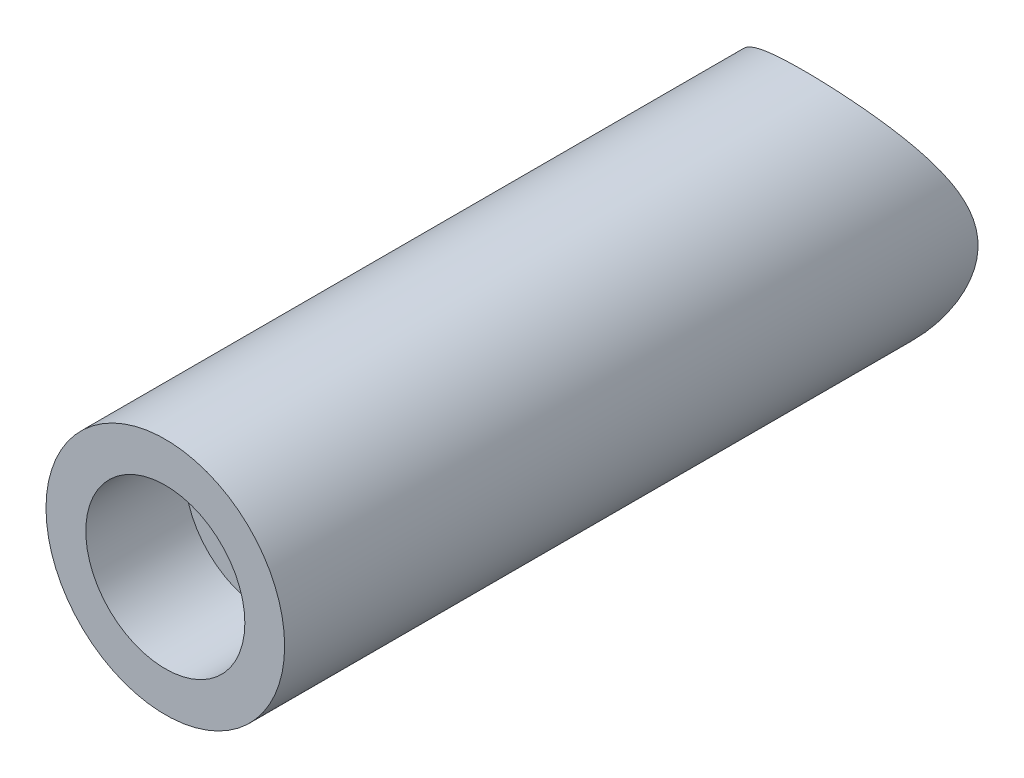
ISO-10303-21;
HEADER;
FILE_DESCRIPTION(('STEP AP214'),'2;1');
FILE_NAME('part.step','',(''),(''),'','','');
FILE_SCHEMA(('AUTOMOTIVE_DESIGN { 1 0 10303 214 1 1 1 1 }'));
ENDSEC;
DATA;
#1=APPLICATION_CONTEXT('core data for automotive mechanical design processes');
#2=APPLICATION_PROTOCOL_DEFINITION('international standard','automotive_design',2000,#1);
#3=PRODUCT_CONTEXT('',#1,'mechanical');
#4=PRODUCT('Part','Part','',(#3));
#5=PRODUCT_RELATED_PRODUCT_CATEGORY('part','',(#4));
#6=PRODUCT_DEFINITION_FORMATION('','',#4);
#7=PRODUCT_DEFINITION_CONTEXT('part definition',#1,'design');
#8=PRODUCT_DEFINITION('design','',#6,#7);
#9=PRODUCT_DEFINITION_SHAPE('','',#8);
#10=(LENGTH_UNIT() NAMED_UNIT(*) SI_UNIT(.MILLI.,.METRE.));
#11=(NAMED_UNIT(*) PLANE_ANGLE_UNIT() SI_UNIT($,.RADIAN.));
#12=(NAMED_UNIT(*) SI_UNIT($,.STERADIAN.) SOLID_ANGLE_UNIT());
#13=UNCERTAINTY_MEASURE_WITH_UNIT(LENGTH_MEASURE(1.E-05),#10,'distance_accuracy_value','');
#14=(GEOMETRIC_REPRESENTATION_CONTEXT(3) GLOBAL_UNCERTAINTY_ASSIGNED_CONTEXT((#13)) GLOBAL_UNIT_ASSIGNED_CONTEXT((#10,
#11,#12)) REPRESENTATION_CONTEXT('',''));
#15=CARTESIAN_POINT('',(0.,0.,0.));
#16=DIRECTION('',(0.,0.,1.));
#17=DIRECTION('',(1.,0.,0.));
#18=AXIS2_PLACEMENT_3D('',#15,#16,#17);
#19=CARTESIAN_POINT('',(0.,0.,762.));
#20=DIRECTION('',(0.,0.,-1.));
#21=DIRECTION('',(-1.,0.,0.));
#22=AXIS2_PLACEMENT_3D('',#19,#20,#21);
#23=CYLINDRICAL_SURFACE('',#22,114.3);
#24=CARTESIAN_POINT('',(-114.3,0.,97.7038659624071));
#25=CARTESIAN_POINT('',(-114.299998173717,-1.32571052443829,97.7038698130253));
#26=CARTESIAN_POINT('',(-114.276918905177,-2.65147226982843,97.7308874947989));
#27=CARTESIAN_POINT('',(-114.184775988168,-5.29924886023999,97.8385264291202));
#28=CARTESIAN_POINT('',(-114.115709834249,-6.62126349717085,97.9191506022472));
#29=CARTESIAN_POINT('',(-113.9321036409,-9.25811839449361,98.1327212714783));
#30=CARTESIAN_POINT('',(-113.817555207513,-10.5729572851364,98.2656774256426));
#31=CARTESIAN_POINT('',(-113.543817266426,-13.1918550803273,98.5818473309332));
#32=CARTESIAN_POINT('',(-113.384628125858,-14.4959140734404,98.7650606687355));
#33=CARTESIAN_POINT('',(-113.022145680452,-17.0941601595688,99.1796651281372));
#34=CARTESIAN_POINT('',(-112.81872340947,-18.3883066824846,99.4111970462304));
#35=CARTESIAN_POINT('',(-112.369302994794,-20.9602989364301,99.9189172369976));
#36=CARTESIAN_POINT('',(-112.123304860284,-22.238144670976,100.195105500039));
#37=CARTESIAN_POINT('',(-111.590077519137,-24.7754974381422,100.788635734019));
#38=CARTESIAN_POINT('',(-111.302848515059,-26.0350045608226,101.105977502779));
#39=CARTESIAN_POINT('',(-110.688483428269,-28.5342958023421,101.778201865702));
#40=CARTESIAN_POINT('',(-110.361340442697,-29.7740764675914,102.133090952012));
#41=CARTESIAN_POINT('',(-109.596950572759,-32.4865033467598,102.953483203549));
#42=CARTESIAN_POINT('',(-109.150919210965,-33.9543484556617,103.426692226416));
#43=CARTESIAN_POINT('',(-108.204970422224,-36.8579191384516,104.415937995963));
#44=CARTESIAN_POINT('',(-107.705048742035,-38.2936421663207,104.931978122307));
#45=CARTESIAN_POINT('',(-106.653254256036,-41.1322851875387,106.000853917905));
#46=CARTESIAN_POINT('',(-106.101371127357,-42.5351985933953,106.553696892142));
#47=CARTESIAN_POINT('',(-104.947526781943,-45.3074032081738,107.690333100009));
#48=CARTESIAN_POINT('',(-104.345566316558,-46.6766949211488,108.274125869228));
#49=CARTESIAN_POINT('',(-103.092544047155,-49.3826116058595,109.467859207817));
#50=CARTESIAN_POINT('',(-102.441440115021,-50.719207219145,110.077822013594));
#51=CARTESIAN_POINT('',(-101.091879529356,-53.3583974541999,111.318495685108));
#52=CARTESIAN_POINT('',(-100.393422748018,-54.6609919841869,111.949206606841));
#53=CARTESIAN_POINT('',(-98.9503084833774,-57.231978388269,113.22676572314));
#54=CARTESIAN_POINT('',(-98.2056561221241,-58.5003740319575,113.873612123905));
#55=CARTESIAN_POINT('',(-96.6709577319723,-61.0030375208604,115.1793229561));
#56=CARTESIAN_POINT('',(-95.8809116432499,-62.237305321095,115.838187403366));
#57=CARTESIAN_POINT('',(-94.2368093095596,-64.7005274612418,117.179825844507));
#58=CARTESIAN_POINT('',(-93.3816774819301,-65.9286570395399,117.862795775737));
#59=CARTESIAN_POINT('',(-91.6251939174194,-68.3487332204183,119.233385617021));
#60=CARTESIAN_POINT('',(-90.7238420150354,-69.5406796934116,119.921005543719));
#61=CARTESIAN_POINT('',(-88.8754230438265,-71.8879736637333,121.297247676776));
#62=CARTESIAN_POINT('',(-87.928356193339,-73.0433213358162,121.985869878333));
#63=CARTESIAN_POINT('',(-85.9888529579916,-75.316930622113,123.3607136663));
#64=CARTESIAN_POINT('',(-84.9964135198232,-76.4351897317216,124.046935087797));
#65=CARTESIAN_POINT('',(-82.9674199386797,-78.6328941910222,125.41306640924));
#66=CARTESIAN_POINT('',(-81.9309026542488,-79.7123706299603,126.092981025165));
#67=CARTESIAN_POINT('',(-79.8133393373266,-81.8325462896738,127.443883904911));
#68=CARTESIAN_POINT('',(-78.7322934423287,-82.8732456301644,128.114872196287));
#69=CARTESIAN_POINT('',(-76.5260606544396,-84.9147261770998,129.444800849204));
#70=CARTESIAN_POINT('',(-75.4008751647396,-85.9155086504593,130.10374159276));
#71=CARTESIAN_POINT('',(-73.1067302081591,-87.875892593698,131.406550446403));
#72=CARTESIAN_POINT('',(-71.9377708486942,-88.8354941646174,132.050418593469));
#73=CARTESIAN_POINT('',(-69.6066597162465,-90.6725509071403,133.293356709369));
#74=CARTESIAN_POINT('',(-68.4462904890665,-91.5517635937006,133.893171763262));
#75=CARTESIAN_POINT('',(-66.0863734558186,-93.2695618314133,135.073562291147));
#76=CARTESIAN_POINT('',(-64.8868265356276,-94.108148300133,135.654138199572));
#77=CARTESIAN_POINT('',(-62.4491172219489,-95.7431551649096,136.793469834306));
#78=CARTESIAN_POINT('',(-61.2109527493769,-96.5395732844663,137.352224382141));
#79=CARTESIAN_POINT('',(-58.6969985382342,-98.0883877541153,138.445210185389));
#80=CARTESIAN_POINT('',(-57.4212123793237,-98.8407882722347,138.979443761658));
#81=CARTESIAN_POINT('',(-54.8327518308268,-100.299884417014,140.020895333341));
#82=CARTESIAN_POINT('',(-53.5200731242619,-101.006574662678,140.528110146881));
#83=CARTESIAN_POINT('',(-50.8593364036407,-102.372133334599,141.512809867642));
#84=CARTESIAN_POINT('',(-49.5112821549196,-103.031006822535,141.99029792085));
#85=CARTESIAN_POINT('',(-46.7809613317444,-104.299077449738,142.913098935584));
#86=CARTESIAN_POINT('',(-45.3986903683221,-104.908268172718,143.358407740474));
#87=CARTESIAN_POINT('',(-42.602025707983,-106.074750030407,144.214219027267));
#88=CARTESIAN_POINT('',(-41.1876357535606,-106.632047173532,144.624725538204));
#89=CARTESIAN_POINT('',(-38.3151775342389,-107.697752163739,145.41224549907));
#90=CARTESIAN_POINT('',(-36.856823427939,-108.205650371059,145.788907260424));
#91=CARTESIAN_POINT('',(-33.9117775581418,-109.164460533069,146.501952689854));
#92=CARTESIAN_POINT('',(-32.4250857405833,-109.615372379031,146.838336281081));
#93=CARTESIAN_POINT('',(-29.4260986173269,-110.458231202929,147.468599908935));
#94=CARTESIAN_POINT('',(-27.9138022505499,-110.85017573051,147.762478179258));
#95=CARTESIAN_POINT('',(-24.8668078399622,-111.573220517443,148.30567089199));
#96=CARTESIAN_POINT('',(-23.3321098956016,-111.904321046819,148.554985532171));
#97=CARTESIAN_POINT('',(-20.2453652392331,-112.503708363047,149.007017014512));
#98=CARTESIAN_POINT('',(-18.6933381430456,-112.772059855379,149.209781853878));
#99=CARTESIAN_POINT('',(-15.574096454101,-113.244981374103,149.567534256514));
#100=CARTESIAN_POINT('',(-14.0068817017195,-113.449550729384,149.722521317068));
#101=CARTESIAN_POINT('',(-10.8615198384025,-113.793760734167,149.983508487044));
#102=CARTESIAN_POINT('',(-9.28337443339063,-113.933411293564,150.089516073198));
#103=CARTESIAN_POINT('',(-6.12013058354336,-114.147039497853,150.251746042448));
#104=CARTESIAN_POINT('',(-4.53503244770575,-114.221020032163,150.307970615949));
#105=CARTESIAN_POINT('',(-1.6059721282407,-114.296610331622,150.365422012729));
#106=CARTESIAN_POINT('',(-0.262378327800986,-114.307592787285,150.373771475896));
#107=CARTESIAN_POINT('',(2.42409507224472,-114.282186032159,150.354459118977));
#108=CARTESIAN_POINT('',(3.76697468463496,-114.245797699981,150.326797966796));
#109=CARTESIAN_POINT('',(6.44923271836693,-114.125805408445,150.235626168875));
#110=CARTESIAN_POINT('',(7.78861154295359,-114.042207151739,150.172119852996));
#111=CARTESIAN_POINT('',(10.4614661368621,-113.828139020554,150.009619033101));
#112=CARTESIAN_POINT('',(11.794941851591,-113.697668713509,149.910624201572));
#113=CARTESIAN_POINT('',(14.453452259585,-113.390379863655,149.677699173329));
#114=CARTESIAN_POINT('',(15.7784870460176,-113.213561833326,149.543769362901));
#115=CARTESIAN_POINT('',(18.417723852275,-112.814266453811,149.241706951125));
#116=CARTESIAN_POINT('',(19.731925880814,-112.591789141359,149.073574377294));
#117=CARTESIAN_POINT('',(22.3472407984698,-112.102010798898,148.704002729515));
#118=CARTESIAN_POINT('',(23.6483534627616,-111.834709000364,148.502563084511));
#119=CARTESIAN_POINT('',(26.2353319292522,-111.256254356986,148.067428026711));
#120=CARTESIAN_POINT('',(27.5211977949877,-110.945101694947,147.833732748383));
#121=CARTESIAN_POINT('',(30.0353086076602,-110.290542609172,147.343149743246));
#122=CARTESIAN_POINT('',(31.2640896802623,-109.948467602417,147.0872293486));
#123=CARTESIAN_POINT('',(33.7039746871109,-109.225232034146,146.5473944756));
#124=CARTESIAN_POINT('',(34.9150771141807,-108.844068162121,146.263477626251));
#125=CARTESIAN_POINT('',(37.3178659985695,-108.043833596687,145.668952270368));
#126=CARTESIAN_POINT('',(38.5095550587382,-107.624768035145,145.358347377664));
#127=CARTESIAN_POINT('',(40.8723852026779,-106.749828315311,144.711729080493));
#128=CARTESIAN_POINT('',(42.043524573344,-106.293951105832,144.375713569975));
#129=CARTESIAN_POINT('',(45.5241608236572,-104.872873714205,143.331612411431));
#130=CARTESIAN_POINT('',(47.8013054793754,-103.854084163244,142.587365096406));
#131=CARTESIAN_POINT('',(52.2604058532515,-101.683294251496,141.014108139606));
#132=CARTESIAN_POINT('',(54.442355323226,-100.53128516484,140.185092945955));
#133=CARTESIAN_POINT('',(58.9868097052996,-97.9426147703887,138.339695632252));
#134=CARTESIAN_POINT('',(61.3351793512741,-96.4884495442692,137.313021891023));
#135=CARTESIAN_POINT('',(65.8970092404361,-93.4324028824192,135.183054929223));
#136=CARTESIAN_POINT('',(68.1104593942056,-91.8305104219489,134.079755991709));
#137=CARTESIAN_POINT('',(72.4006634291004,-88.4874985835257,131.812639660078));
#138=CARTESIAN_POINT('',(74.4772769298135,-86.7462401634128,130.648762243337));
#139=CARTESIAN_POINT('',(78.4889560051574,-83.1339870018355,128.278782211913));
#140=CARTESIAN_POINT('',(80.4240155517377,-81.2629867419386,127.072677802232));
#141=CARTESIAN_POINT('',(83.4089893796306,-78.1667677344974,125.121038075725));
#142=CARTESIAN_POINT('',(84.5048511623281,-76.9806689641724,124.383110117542));
#143=CARTESIAN_POINT('',(86.6440820279219,-74.5647125815516,122.902523035325));
#144=CARTESIAN_POINT('',(87.687449482971,-73.3348536142701,122.159863765378));
#145=CARTESIAN_POINT('',(89.7213439242492,-70.8319942466994,120.673951258201));
#146=CARTESIAN_POINT('',(90.7118586274911,-69.5589839294686,119.930697923293));
#147=CARTESIAN_POINT('',(92.6392060164058,-66.9706725337005,118.448262536636));
#148=CARTESIAN_POINT('',(93.5760393578676,-65.6553719721011,117.70908043525));
#149=CARTESIAN_POINT('',(95.395293013403,-62.982863175256,116.239583245114));
#150=CARTESIAN_POINT('',(96.2777139622631,-61.6256554291857,115.509268052999));
#151=CARTESIAN_POINT('',(97.9872494605733,-58.8695062426798,114.062650269632));
#152=CARTESIAN_POINT('',(98.8143627902055,-57.4705638827644,113.346347987684));
#153=CARTESIAN_POINT('',(100.411861784756,-54.6314942692871,111.933595943881));
#154=CARTESIAN_POINT('',(101.182264809635,-53.19137980818,111.237140147036));
#155=CARTESIAN_POINT('',(102.665082907228,-50.2698149886761,109.870074852314));
#156=CARTESIAN_POINT('',(103.37750211614,-48.7883675888505,109.199463512657));
#157=CARTESIAN_POINT('',(105.044781609568,-45.1192707388406,107.601061001719));
#158=CARTESIAN_POINT('',(105.967456072651,-42.9091565680538,106.690751528633));
#159=CARTESIAN_POINT('',(107.68189470392,-38.4045256306757,104.960132260929));
#160=CARTESIAN_POINT('',(108.473667017271,-36.1100141264345,104.13981686765));
#161=CARTESIAN_POINT('',(109.916793760954,-31.4441617813034,102.615469246897));
#162=CARTESIAN_POINT('',(110.568424975051,-29.0729832227232,101.911208462929));
#163=CARTESIAN_POINT('',(111.434698021728,-25.4623506063328,100.960522571966));
#164=CARTESIAN_POINT('',(111.704934186234,-24.2497859465743,100.661236275354));
#165=CARTESIAN_POINT('',(112.207208713749,-21.807919836428,100.101045934064));
#166=CARTESIAN_POINT('',(112.439248679867,-20.578619090806,99.8401402785847));
#167=CARTESIAN_POINT('',(112.8301960648,-18.3016702290552,99.3979624375643));
#168=CARTESIAN_POINT('',(112.994865461198,-17.256181719917,99.2106239262661));
#169=CARTESIAN_POINT('',(113.295671614028,-15.1560510050525,98.8669733082949));
#170=CARTESIAN_POINT('',(113.431809463897,-14.101409151731,98.7106600126294));
#171=CARTESIAN_POINT('',(113.674962539325,-11.9844895350164,98.4305477734613));
#172=CARTESIAN_POINT('',(113.781978372058,-10.9222119312978,98.3067481520716));
#173=CARTESIAN_POINT('',(113.966385597272,-8.79181123283027,98.0929066472832));
#174=CARTESIAN_POINT('',(114.043780285253,-7.72368880176686,98.0028610086085));
#175=CARTESIAN_POINT('',(114.168547975783,-5.58394923345128,97.85748445637));
#176=CARTESIAN_POINT('',(114.215938283255,-4.51233446954502,97.8021335329336));
#177=CARTESIAN_POINT('',(114.280525786469,-2.36704832575975,97.7266561724593));
#178=CARTESIAN_POINT('',(114.297725690797,-1.29337713902952,97.7065265754786));
#179=CARTESIAN_POINT('',(114.301852400701,0.854177417945506,97.7016989228091));
#180=CARTESIAN_POINT('',(114.28877711714,1.92806079771965,97.7170033122398));
#181=CARTESIAN_POINT('',(114.232416407817,4.07394802676853,97.7828836594403));
#182=CARTESIAN_POINT('',(114.189130961154,5.14595187474252,97.8334596416104));
#183=CARTESIAN_POINT('',(114.072679941897,7.28407979596656,97.9692149554397));
#184=CARTESIAN_POINT('',(113.999571277776,8.35021116965031,98.0543283813489));
#185=CARTESIAN_POINT('',(113.823826061344,10.4768869837084,98.2582828306572));
#186=CARTESIAN_POINT('',(113.721186787059,11.5374308998805,98.3771269631574));
#187=CARTESIAN_POINT('',(113.486873553735,13.6510052600857,98.6473360158865));
#188=CARTESIAN_POINT('',(113.355202889876,14.704036542841,98.7986972452419));
#189=CARTESIAN_POINT('',(113.063381712549,16.8012732740561,99.1325186926179));
#190=CARTESIAN_POINT('',(112.903228396575,17.845477843425,99.3149819708017));
#191=CARTESIAN_POINT('',(112.554867436461,19.9249739010832,99.709611281908));
#192=CARTESIAN_POINT('',(112.366623859489,20.9602521499486,99.9218153375395));
#193=CARTESIAN_POINT('',(111.962934329755,23.0193945366152,100.373943525734));
#194=CARTESIAN_POINT('',(111.747486426479,24.0432578502465,100.613869645827));
#195=CARTESIAN_POINT('',(111.061361416944,27.0963892731885,101.372455711512));
#196=CARTESIAN_POINT('',(110.550877397408,29.1073508486771,101.9299526873));
#197=CARTESIAN_POINT('',(109.578257714592,32.5483095317125,102.973325129199));
#198=CARTESIAN_POINT('',(109.139119570571,33.9911273110251,103.439069263327));
#199=CARTESIAN_POINT('',(108.208753368178,36.8457425308045,104.411944265598));
#200=CARTESIAN_POINT('',(107.717524705469,38.2575396111499,104.919075613886));
#201=CARTESIAN_POINT('',(106.684708167423,41.0497270160397,105.969103844718));
#202=CARTESIAN_POINT('',(106.143098738842,42.4301035814237,106.512016005326));
#203=CARTESIAN_POINT('',(105.011402873012,45.158345708731,107.627933899075));
#204=CARTESIAN_POINT('',(104.421317679111,46.5062121033563,108.200938860236));
#205=CARTESIAN_POINT('',(103.193056233773,49.1715374074799,109.372987525551));
#206=CARTESIAN_POINT('',(102.554798226302,50.4889394307177,109.972074731325));
#207=CARTESIAN_POINT('',(101.232325676434,53.0908275677335,111.190647777368));
#208=CARTESIAN_POINT('',(100.548110359798,54.3753131264655,111.810133961208));
#209=CARTESIAN_POINT('',(99.1348791100857,56.9110908787909,113.065043442586));
#210=CARTESIAN_POINT('',(98.4058702533745,58.1623882708754,113.700464213481));
#211=CARTESIAN_POINT('',(96.9038054314024,60.6319322327073,114.983318070945));
#212=CARTESIAN_POINT('',(96.1307493666633,61.8501787278018,115.630751184641));
#213=CARTESIAN_POINT('',(94.5106434263831,64.299821029876,116.95902206075));
#214=CARTESIAN_POINT('',(93.6618899747692,65.5299135549801,117.640185471773));
#215=CARTESIAN_POINT('',(91.9182463893704,67.9540667088252,119.007558407333));
#216=CARTESIAN_POINT('',(91.0233559824473,69.1481271241841,119.693767961723));
#217=CARTESIAN_POINT('',(89.1879331895229,71.4998421291102,121.067593039968));
#218=CARTESIAN_POINT('',(88.2474000346704,72.6574961048702,121.755208587319));
#219=CARTESIAN_POINT('',(86.3210619507514,74.9359051028135,123.128424544942));
#220=CARTESIAN_POINT('',(85.3352539834384,76.0566576399702,123.814024816681));
#221=CARTESIAN_POINT('',(83.3195625940093,78.2596177381419,125.179337629126));
#222=CARTESIAN_POINT('',(82.2897135075308,79.3418541632924,125.859054277067));
#223=CARTESIAN_POINT('',(80.1855799877359,81.4677817533022,127.209949553169));
#224=CARTESIAN_POINT('',(79.111295676184,82.5114730237708,127.88112820472));
#225=CARTESIAN_POINT('',(76.9186882389633,84.5591830456852,129.21182349869));
#226=CARTESIAN_POINT('',(75.8003670563976,85.5632035436748,129.871340653809));
#227=CARTESIAN_POINT('',(73.520031190375,87.5303511238096,131.175705610703));
#228=CARTESIAN_POINT('',(72.3580165730894,88.4934782678809,131.82055343469));
#229=CARTESIAN_POINT('',(70.0348358635864,90.3423088342347,133.068894772382));
#230=CARTESIAN_POINT('',(68.8752486290175,91.2295597646636,133.673034115635));
#231=CARTESIAN_POINT('',(66.5165467976521,92.9633329623523,134.862258587475));
#232=CARTESIAN_POINT('',(65.3174330766853,93.8098561310387,135.447344137687));
#233=CARTESIAN_POINT('',(62.8801792345163,95.4606703587526,136.595876497842));
#234=CARTESIAN_POINT('',(61.6420353508499,96.2649573262116,137.159321209948));
#235=CARTESIAN_POINT('',(59.1277482984889,97.8293995142698,138.261812789089));
#236=CARTESIAN_POINT('',(57.8516087422204,98.5895589101417,138.80086196332));
#237=CARTESIAN_POINT('',(55.2629296460309,100.063558875475,139.851686745378));
#238=CARTESIAN_POINT('',(53.9504107983424,100.777425034558,140.363477392519));
#239=CARTESIAN_POINT('',(51.2896365158416,102.157274909404,141.357437942751));
#240=CARTESIAN_POINT('',(49.9413847738017,102.823263546807,141.839610889693));
#241=CARTESIAN_POINT('',(47.2105801131384,104.10536114941,142.771768739908));
#242=CARTESIAN_POINT('',(45.8280296432864,104.721473662224,143.221755932238));
#243=CARTESIAN_POINT('',(43.0303051566517,105.901783212694,144.087029232084));
#244=CARTESIAN_POINT('',(41.6151323386679,106.465982154267,144.502316612157));
#245=CARTESIAN_POINT('',(38.968381118068,107.459962119761,145.236338678566));
#246=CARTESIAN_POINT('',(37.7410317197859,107.897221909483,145.560220798465));
#247=CARTESIAN_POINT('',(35.2656781709506,108.731447271068,146.179666784529));
#248=CARTESIAN_POINT('',(34.0176746081311,109.128413987224,146.475231454875));
#249=CARTESIAN_POINT('',(31.5026211953507,109.880834305694,147.036663591696));
#250=CARTESIAN_POINT('',(30.235571527933,110.236288305593,147.302531342591));
#251=CARTESIAN_POINT('',(27.6843401672249,110.90448999921,147.803255664805));
#252=CARTESIAN_POINT('',(26.4001603681565,111.217242372532,148.038115634125));
#253=CARTESIAN_POINT('',(23.8170310182771,111.798886393036,148.4755862172));
#254=CARTESIAN_POINT('',(22.5180878386512,112.067796245187,148.678210215621));
#255=CARTESIAN_POINT('',(19.9070271446805,112.560941049602,149.050275681599));
#256=CARTESIAN_POINT('',(18.594909659651,112.785176101251,149.219717222976));
#257=CARTESIAN_POINT('',(15.9597326532739,113.188133594019,149.524518521648));
#258=CARTESIAN_POINT('',(14.636672886187,113.366855010122,149.659877511366));
#259=CARTESIAN_POINT('',(11.982032378713,113.678084440244,149.895770450779));
#260=CARTESIAN_POINT('',(10.6504516316536,113.810592418072,149.996304373202));
#261=CARTESIAN_POINT('',(7.97746038904389,114.029177833366,150.162224747943));
#262=CARTESIAN_POINT('',(6.63603269285652,114.115121833382,150.227510187561));
#263=CARTESIAN_POINT('',(3.94971200270816,114.239650416379,150.322125821602));
#264=CARTESIAN_POINT('',(2.604819007177,114.278234977898,150.351455999729));
#265=CARTESIAN_POINT('',(-0.0857978796456954,114.307885625605,150.373993918563));
#266=CARTESIAN_POINT('',(-1.43152177329248,114.298951576474,150.367201556401));
#267=CARTESIAN_POINT('',(-4.12114714151116,114.233601614362,150.317532947901));
#268=CARTESIAN_POINT('',(-5.46504861705792,114.17718572679,150.274656720871));
#269=CARTESIAN_POINT('',(-8.14856045188176,114.017094762763,150.153057287249));
#270=CARTESIAN_POINT('',(-9.48817029479243,113.913414199731,150.074329918987));
#271=CARTESIAN_POINT('',(-12.160375771196,113.659212566383,149.881470407043));
#272=CARTESIAN_POINT('',(-13.4929713894234,113.508691394167,149.76733818634));
#273=CARTESIAN_POINT('',(-16.1486356814571,113.16141058283,149.504305686356));
#274=CARTESIAN_POINT('',(-17.4717045450359,112.9646518674,149.355406101626));
#275=CARTESIAN_POINT('',(-20.1059702064593,112.525654709781,149.023648217325));
#276=CARTESIAN_POINT('',(-21.4171670879197,112.283416588172,148.840790157123));
#277=CARTESIAN_POINT('',(-23.9705472266983,111.765503341395,148.45048143112));
#278=CARTESIAN_POINT('',(-25.2133119981884,111.491665234554,148.244390195053));
#279=CARTESIAN_POINT('',(-27.684190981131,110.903960123872,147.802896356547));
#280=CARTESIAN_POINT('',(-28.9123039260735,110.590089686645,147.567491240035));
#281=CARTESIAN_POINT('',(-31.3519153115673,109.923365412376,147.068497016166));
#282=CARTESIAN_POINT('',(-32.5634159704642,109.570516838462,146.804911714069));
#283=CARTESIAN_POINT('',(-34.9685315838245,108.826818446443,146.25067645232));
#284=CARTESIAN_POINT('',(-36.1621449946176,108.435965370097,145.960024172224));
#285=CARTESIAN_POINT('',(-38.5300031935144,107.617368322587,145.35290841952));
#286=CARTESIAN_POINT('',(-39.7042479728024,107.189624334634,145.036444935164));
#287=CARTESIAN_POINT('',(-42.0321532910892,106.298362935133,144.379004556587));
#288=CARTESIAN_POINT('',(-43.1858122385374,105.834842772252,144.038025777178));
#289=CARTESIAN_POINT('',(-46.6141009334796,104.392344503404,142.980343427068));
#290=CARTESIAN_POINT('',(-48.8564038537882,103.361303269373,142.228800580602));
#291=CARTESIAN_POINT('',(-53.4760520383358,101.055170283726,140.561351362729));
#292=CARTESIAN_POINT('',(-55.8430118173886,99.7658335489604,139.636475801325));
#293=CARTESIAN_POINT('',(-60.4549186896714,97.0405468350207,137.702546075899));
#294=CARTESIAN_POINT('',(-62.6998586317037,95.6045882769707,136.693486986912));
#295=CARTESIAN_POINT('',(-67.0640259006427,92.5955559188842,134.606118563084));
#296=CARTESIAN_POINT('',(-69.1831745924231,91.0223978380651,133.527766770753));
#297=CARTESIAN_POINT('',(-73.2912518605952,87.7483990133657,131.317809939187));
#298=CARTESIAN_POINT('',(-75.2801742160689,86.0475521781067,130.186202360352));
#299=CARTESIAN_POINT('',(-78.3551109382827,83.2310610170699,128.346472719088));
#300=CARTESIAN_POINT('',(-79.4837629954055,82.1538067759625,127.650222180884));
#301=CARTESIAN_POINT('',(-81.6929867865268,79.9573135389291,126.247782982164));
#302=CARTESIAN_POINT('',(-82.7735606750319,78.8380764285146,125.541594768851));
#303=CARTESIAN_POINT('',(-84.8864535271752,76.5584474642194,124.122702506856));
#304=CARTESIAN_POINT('',(-85.9187625411728,75.3980472106493,123.409997150575));
#305=CARTESIAN_POINT('',(-87.9344902455062,73.0371457036047,121.98191019662));
#306=CARTESIAN_POINT('',(-88.917909402193,71.8366448328248,121.266528624544));
#307=CARTESIAN_POINT('',(-90.8360447490988,69.3953485967474,119.836473562423));
#308=CARTESIAN_POINT('',(-91.7707277200221,68.154526659486,119.121800872827));
#309=CARTESIAN_POINT('',(-93.5901208955163,65.6337979452049,117.697745399292));
#310=CARTESIAN_POINT('',(-94.4748305050105,64.3538907030416,116.988362678432));
#311=CARTESIAN_POINT('',(-96.1934309226937,61.7554827956931,115.579381818224));
#312=CARTESIAN_POINT('',(-97.0273303684902,60.4369887469053,114.879782031468));
#313=CARTESIAN_POINT('',(-98.6435004519003,57.7615136380676,113.495058224678));
#314=CARTESIAN_POINT('',(-99.4257728746353,56.4045339110694,112.809933704686));
#315=CARTESIAN_POINT('',(-101.428172395218,52.7590605622822,111.020948531362));
#316=CARTESIAN_POINT('',(-102.603244364158,50.43718613557,109.933682376926));
#317=CARTESIAN_POINT('',(-104.253454760542,46.8766254789229,108.362037893942));
#318=CARTESIAN_POINT('',(-104.784834341127,45.6767032806885,107.847988991501));
#319=CARTESIAN_POINT('',(-105.809151089898,43.2509825111773,106.843219483082));
#320=CARTESIAN_POINT('',(-106.302087636628,42.0251835219937,106.352499254275));
#321=CARTESIAN_POINT('',(-107.719861231326,38.3135233773255,104.922661606444));
#322=CARTESIAN_POINT('',(-108.585834501372,35.78872929283,104.023777281702));
#323=CARTESIAN_POINT('',(-109.757809740622,31.9299414059485,102.781727757305));
#324=CARTESIAN_POINT('',(-110.127301319346,30.6317578559583,102.385427130426));
#325=CARTESIAN_POINT('',(-110.822545690457,28.0122964587107,101.632480912904));
#326=CARTESIAN_POINT('',(-111.148301751834,26.6910203458489,101.275832358828));
#327=CARTESIAN_POINT('',(-111.683550938039,24.3386506279885,100.684852559142));
#328=CARTESIAN_POINT('',(-111.902417642703,23.311955363904,100.441421362921));
#329=CARTESIAN_POINT('',(-112.312796872661,21.2469671976276,99.9823279180292));
#330=CARTESIAN_POINT('',(-112.504310665271,20.2086748351573,99.766664382873));
#331=CARTESIAN_POINT('',(-112.859269853567,18.1216861827073,99.3649460470721));
#332=CARTESIAN_POINT('',(-113.022717331868,17.0729906707896,99.1788890495981));
#333=CARTESIAN_POINT('',(-113.320889417945,14.9665424640886,98.8380632032159));
#334=CARTESIAN_POINT('',(-113.455616366198,13.90879051464,98.6832918048529));
#335=CARTESIAN_POINT('',(-113.695614804369,11.7870881384985,98.4066873256885));
#336=CARTESIAN_POINT('',(-113.800924922849,10.7231477312943,98.2848110559852));
#337=CARTESIAN_POINT('',(-113.981832910087,8.58941900704345,98.0749529743061));
#338=CARTESIAN_POINT('',(-114.057431214822,7.51963077603881,97.9869706649857));
#339=CARTESIAN_POINT('',(-114.178555411963,5.37588815534788,97.8458052059499));
#340=CARTESIAN_POINT('',(-114.224076786393,4.30193316411639,97.7926272843521));
#341=CARTESIAN_POINT('',(-114.28480004142,2.15199671578582,97.7216558433177));
#342=CARTESIAN_POINT('',(-114.300001482306,1.07601522952426,97.7038628370462));
#343=CARTESIAN_POINT('',(-114.3,0.,97.7038659624071));
#344=B_SPLINE_CURVE_WITH_KNOTS('',3,(#24,#25,#26,#27,#28,#29,#30,#31,#32,#33,#34,#35,#36,#37,
#38,#39,#40,#41,#42,#43,#44,#45,#46,#47,#48,#49,#50,#51,#52,#53,#54,#55,#56,#57,#58,#59,#60,#61,
#62,#63,#64,#65,#66,#67,#68,#69,#70,#71,#72,#73,#74,#75,#76,#77,#78,#79,#80,#81,#82,#83,#84,#85,
#86,#87,#88,#89,#90,#91,#92,#93,#94,#95,#96,#97,#98,#99,#100,#101,#102,#103,#104,#105,#106,#107,
#108,#109,#110,#111,#112,#113,#114,#115,#116,#117,#118,#119,#120,#121,#122,#123,#124,#125,#126,
#127,#128,#129,#130,#131,#132,#133,#134,#135,#136,#137,#138,#139,#140,#141,#142,#143,#144,#145,
#146,#147,#148,#149,#150,#151,#152,#153,#154,#155,#156,#157,#158,#159,#160,#161,#162,#163,#164,
#165,#166,#167,#168,#169,#170,#171,#172,#173,#174,#175,#176,#177,#178,#179,#180,#181,#182,#183,
#184,#185,#186,#187,#188,#189,#190,#191,#192,#193,#194,#195,#196,#197,#198,#199,#200,#201,#202,
#203,#204,#205,#206,#207,#208,#209,#210,#211,#212,#213,#214,#215,#216,#217,#218,#219,#220,#221,
#222,#223,#224,#225,#226,#227,#228,#229,#230,#231,#232,#233,#234,#235,#236,#237,#238,#239,#240,
#241,#242,#243,#244,#245,#246,#247,#248,#249,#250,#251,#252,#253,#254,#255,#256,#257,#258,#259,
#260,#261,#262,#263,#264,#265,#266,#267,#268,#269,#270,#271,#272,#273,#274,#275,#276,#277,#278,
#279,#280,#281,#282,#283,#284,#285,#286,#287,#288,#289,#290,#291,#292,#293,#294,#295,#296,#297,
#298,#299,#300,#301,#302,#303,#304,#305,#306,#307,#308,#309,#310,#311,#312,#313,#314,#315,#316,
#317,#318,#319,#320,#321,#322,#323,#324,#325,#326,#327,#328,#329,#330,#331,#332,#333,#334,#335,
#336,#337,#338,#339,#340,#341,#342,#343),.UNSPECIFIED.,.T.,.F.,(4,2,2,2,2,2,2,2,2,2,2,2,2,2,2,2,
2,2,2,2,2,2,2,2,2,2,2,2,2,2,2,2,2,2,2,2,2,2,2,2,2,2,2,2,2,2,2,2,2,2,2,2,2,2,2,2,2,2,2,2,2,2,2,2,
2,2,2,2,2,2,2,2,2,2,2,2,2,2,2,2,2,2,2,2,2,2,2,2,2,2,2,2,2,2,2,2,2,2,2,2,2,2,2,2,2,2,2,2,2,2,2,2,
2,2,2,2,2,2,2,2,2,2,2,2,2,2,2,2,2,2,2,2,2,2,2,2,2,2,2,2,2,2,2,2,2,2,2,2,2,2,2,2,2,2,2,2,2,2,2,
4),(0.,3.97674764168399,7.95371196158995,11.9314105893489,15.9090765047847,19.8984990384128,
23.8879207114714,27.8773227860071,31.867415781905,36.681760231321,41.496484926873,
46.3121681612573,51.1277791552727,55.9475662603005,60.7673663744941,65.5866330331813,
70.4059060432728,75.3398147419792,80.2737411090419,85.2076439136994,90.1418792311282,
95.0720666234883,100.002238793789,104.932254361463,109.862257832304,114.584855117592,
119.307345690448,124.030090952221,128.752388290964,133.475240528694,138.197592093834,
142.920552564987,147.64296551375,152.409835764045,157.176715109253,161.943792484787,
166.71084870367,171.472967340984,176.235136083255,180.996577638493,185.757809684405,
189.787528483008,193.817172541501,197.846329949364,201.875524542009,205.904674584687,
209.933821385834,213.963037274488,217.992236366588,221.893996881997,225.796088118187,
229.6976518022,233.599539205684,241.401921080569,249.204814300608,258.036708091915,
266.869261533074,275.710739559494,284.552593879813,289.877832977536,295.203237109085,
300.529873522627,305.856444850364,311.182954025429,316.509580638744,321.834569843778,
327.159178864266,334.839513802985,342.519370665872,350.183917328434,354.016456526762,
357.848834830907,361.072517177974,364.296075958635,367.519567525044,370.742700357608,
373.963972562024,377.184955749554,380.406161207412,383.627368893658,386.842458432429,
390.057844415817,393.272865627446,396.488203351187,399.707689937725,402.927407488396,
409.366373045624,414.100140587624,418.833963055247,423.569820081775,428.305555676936,
433.0495174767,437.79355921783,442.536853425243,447.280158345565,452.206302912607,
457.132476646559,462.058733390614,466.98532120428,471.908135747692,476.830936802148,
481.753520883516,486.676097510183,491.415417453299,496.154632452834,500.894305712963,
505.633529780171,510.370111402978,515.106205423663,519.841962276625,524.577545377579,
528.604232632433,532.63080550044,536.657339801209,540.683432485771,544.707849112627,
548.732256786441,552.756755086259,556.781256537861,560.81723072819,564.853206747588,
568.889194260331,572.925179613257,576.961633590625,580.998096349139,585.034478477761,
589.070832155465,592.937257202156,596.804014077356,600.670249469962,604.536816619395,
608.403385528662,612.270252089643,620.002807149029,628.543666848364,637.085026562008,
645.631670641511,654.178722697168,659.303258609419,664.427564646251,669.552922425372,
674.678231305312,679.806989188267,684.935808130995,690.063752739986,695.191519945653,
703.644799394626,707.872193180663,712.099655290885,720.537944308356,724.757013718964,
728.975767601402,732.207934363805,735.439951324808,738.671728355569,741.903241923455,
745.130491880598,748.357694480747,751.585381741773,754.813115811576),.UNSPECIFIED.);
#345=CARTESIAN_POINT('',(-114.3,0.,97.7038659624071));
#346=VERTEX_POINT('',#345);
#347=EDGE_CURVE('E43',#346,#346,#344,.T.);
#348=ORIENTED_EDGE('',*,*,#347,.T.);
#349=EDGE_LOOP('',(#348));
#350=FACE_BOUND('',#349,.T.);
#351=CARTESIAN_POINT('',(0.,0.,762.));
#352=DIRECTION('',(0.,0.,1.));
#353=DIRECTION('',(1.,0.,0.));
#354=AXIS2_PLACEMENT_3D('',#351,#352,#353);
#355=CIRCLE('',#354,114.3);
#356=CARTESIAN_POINT('',(114.3,0.,762.));
#357=VERTEX_POINT('',#356);
#358=EDGE_CURVE('E10',#357,#357,#355,.T.);
#359=ORIENTED_EDGE('',*,*,#358,.F.);
#360=EDGE_LOOP('',(#359));
#361=FACE_BOUND('',#360,.T.);
#362=ADVANCED_FACE('F39',(#350,#361),#23,.T.);
#363=CARTESIAN_POINT('',(0.,0.,762.));
#364=DIRECTION('',(0.,0.,1.));
#365=DIRECTION('',(1.,0.,0.));
#366=AXIS2_PLACEMENT_3D('',#363,#364,#365);
#367=PLANE('',#366);
#368=CARTESIAN_POINT('',(0.,0.,762.));
#369=DIRECTION('',(0.,0.,1.));
#370=DIRECTION('',(1.,0.,0.));
#371=AXIS2_PLACEMENT_3D('',#368,#369,#370);
#372=CIRCLE('',#371,76.2);
#373=CARTESIAN_POINT('',(76.2,0.,762.));
#374=VERTEX_POINT('',#373);
#375=EDGE_CURVE('E57',#374,#374,#372,.T.);
#376=ORIENTED_EDGE('',*,*,#375,.F.);
#377=EDGE_LOOP('',(#376));
#378=FACE_BOUND('',#377,.T.);
#379=ORIENTED_EDGE('',*,*,#358,.T.);
#380=EDGE_LOOP('',(#379));
#381=FACE_BOUND('',#380,.T.);
#382=ADVANCED_FACE('F81',(#378,#381),#367,.T.);
#383=CARTESIAN_POINT('',(0.,0.,667.004));
#384=DIRECTION('',(0.,0.,1.));
#385=DIRECTION('',(1.,0.,0.));
#386=AXIS2_PLACEMENT_3D('',#383,#384,#385);
#387=CYLINDRICAL_SURFACE('',#386,76.2);
#388=CARTESIAN_POINT('',(0.,0.,667.004));
#389=DIRECTION('',(0.,0.,1.));
#390=DIRECTION('',(1.,0.,0.));
#391=AXIS2_PLACEMENT_3D('',#388,#389,#390);
#392=CIRCLE('',#391,76.2);
#393=CARTESIAN_POINT('',(76.2,0.,667.004));
#394=VERTEX_POINT('',#393);
#395=EDGE_CURVE('E52',#394,#394,#392,.T.);
#396=ORIENTED_EDGE('',*,*,#395,.F.);
#397=EDGE_LOOP('',(#396));
#398=FACE_BOUND('',#397,.T.);
#399=ORIENTED_EDGE('',*,*,#375,.T.);
#400=EDGE_LOOP('',(#399));
#401=FACE_BOUND('',#400,.T.);
#402=ADVANCED_FACE('F76',(#398,#401),#387,.F.);
#403=CARTESIAN_POINT('',(0.,0.,667.004));
#404=DIRECTION('',(0.,0.,1.));
#405=DIRECTION('',(1.,0.,0.));
#406=AXIS2_PLACEMENT_3D('',#403,#404,#405);
#407=PLANE('',#406);
#408=ORIENTED_EDGE('',*,*,#395,.T.);
#409=EDGE_LOOP('',(#408));
#410=FACE_BOUND('',#409,.T.);
#411=ADVANCED_FACE('F72',(#410),#407,.T.);
#412=CARTESIAN_POINT('',(0.,-276.352,0.));
#413=DIRECTION('',(0.,1.,0.));
#414=DIRECTION('',(0.,0.,1.));
#415=AXIS2_PLACEMENT_3D('',#412,#413,#414);
#416=CYLINDRICAL_SURFACE('',#415,150.368);
#417=ORIENTED_EDGE('',*,*,#347,.F.);
#418=EDGE_LOOP('',(#417));
#419=FACE_BOUND('',#418,.T.);
#420=ADVANCED_FACE('F70',(#419),#416,.F.);
#421=CLOSED_SHELL('',(#362,#382,#402,#411,#420));
#422=MANIFOLD_SOLID_BREP('B2',#421);
#423=ADVANCED_BREP_SHAPE_REPRESENTATION('',(#18,#422),#14);
#424=SHAPE_DEFINITION_REPRESENTATION(#9,#423);
ENDSEC;
END-ISO-10303-21;
